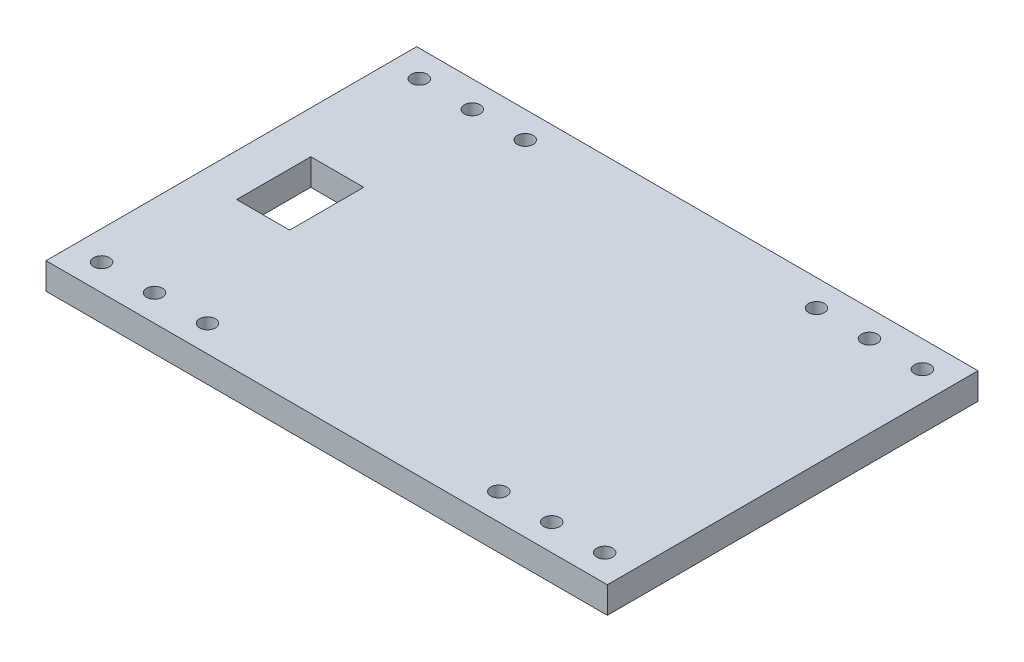
ISO-10303-21;
HEADER;
FILE_DESCRIPTION(('STEP AP214'),'2;1');
FILE_NAME('part.step','',(''),(''),'','','');
FILE_SCHEMA(('AUTOMOTIVE_DESIGN { 1 0 10303 214 1 1 1 1 }'));
ENDSEC;
DATA;
#1=APPLICATION_CONTEXT('core data for automotive mechanical design processes');
#2=APPLICATION_PROTOCOL_DEFINITION('international standard','automotive_design',2000,#1);
#3=PRODUCT_CONTEXT('',#1,'mechanical');
#4=PRODUCT('Part','Part','',(#3));
#5=PRODUCT_RELATED_PRODUCT_CATEGORY('part','',(#4));
#6=PRODUCT_DEFINITION_FORMATION('','',#4);
#7=PRODUCT_DEFINITION_CONTEXT('part definition',#1,'design');
#8=PRODUCT_DEFINITION('design','',#6,#7);
#9=PRODUCT_DEFINITION_SHAPE('','',#8);
#10=(LENGTH_UNIT() NAMED_UNIT(*) SI_UNIT(.MILLI.,.METRE.));
#11=(NAMED_UNIT(*) PLANE_ANGLE_UNIT() SI_UNIT($,.RADIAN.));
#12=(NAMED_UNIT(*) SI_UNIT($,.STERADIAN.) SOLID_ANGLE_UNIT());
#13=UNCERTAINTY_MEASURE_WITH_UNIT(LENGTH_MEASURE(1.E-05),#10,'distance_accuracy_value','');
#14=(GEOMETRIC_REPRESENTATION_CONTEXT(3) GLOBAL_UNCERTAINTY_ASSIGNED_CONTEXT((#13)) GLOBAL_UNIT_ASSIGNED_CONTEXT((#10,
#11,#12)) REPRESENTATION_CONTEXT('',''));
#15=CARTESIAN_POINT('',(0.,0.,0.));
#16=DIRECTION('',(0.,0.,1.));
#17=DIRECTION('',(1.,0.,0.));
#18=AXIS2_PLACEMENT_3D('',#15,#16,#17);
#19=CARTESIAN_POINT('',(-60.,5.,-35.));
#20=DIRECTION('',(0.,0.,1.));
#21=DIRECTION('',(1.,0.,0.));
#22=AXIS2_PLACEMENT_3D('',#19,#20,#21);
#23=PLANE('',#22);
#24=DIRECTION('',(-1.,0.,0.));
#25=VECTOR('',#24,1.);
#26=CARTESIAN_POINT('',(-60.,5.,-35.));
#27=LINE('',#26,#25);
#28=CARTESIAN_POINT('',(53.,5.,-35.));
#29=VERTEX_POINT('',#28);
#30=CARTESIAN_POINT('',(-53.,5.,-35.));
#31=VERTEX_POINT('',#30);
#32=EDGE_CURVE('E42',#29,#31,#27,.T.);
#33=ORIENTED_EDGE('',*,*,#32,.F.);
#34=DIRECTION('',(0.,1.,0.));
#35=VECTOR('',#34,1.);
#36=CARTESIAN_POINT('',(53.,0.,-35.));
#37=LINE('',#36,#35);
#38=CARTESIAN_POINT('',(53.,0.,-35.));
#39=VERTEX_POINT('',#38);
#40=EDGE_CURVE('E100',#39,#29,#37,.T.);
#41=ORIENTED_EDGE('',*,*,#40,.F.);
#42=DIRECTION('',(-1.,0.,0.));
#43=VECTOR('',#42,1.);
#44=CARTESIAN_POINT('',(-60.,0.,-35.));
#45=LINE('',#44,#43);
#46=CARTESIAN_POINT('',(-53.,0.,-35.));
#47=VERTEX_POINT('',#46);
#48=EDGE_CURVE('E111',#39,#47,#45,.T.);
#49=ORIENTED_EDGE('',*,*,#48,.T.);
#50=DIRECTION('',(0.,1.,0.));
#51=VECTOR('',#50,1.);
#52=CARTESIAN_POINT('',(-53.,0.,-35.));
#53=LINE('',#52,#51);
#54=EDGE_CURVE('E50',#47,#31,#53,.T.);
#55=ORIENTED_EDGE('',*,*,#54,.T.);
#56=EDGE_LOOP('',(#33,#41,#49,#55));
#57=FACE_BOUND('',#56,.T.);
#58=ADVANCED_FACE('F34',(#57),#23,.F.);
#59=CARTESIAN_POINT('',(-60.,5.,35.));
#60=DIRECTION('',(0.,0.,-1.));
#61=DIRECTION('',(-1.,0.,0.));
#62=AXIS2_PLACEMENT_3D('',#59,#60,#61);
#63=PLANE('',#62);
#64=DIRECTION('',(1.,0.,0.));
#65=VECTOR('',#64,1.);
#66=CARTESIAN_POINT('',(-60.,0.,35.));
#67=LINE('',#66,#65);
#68=CARTESIAN_POINT('',(-53.,0.,35.));
#69=VERTEX_POINT('',#68);
#70=CARTESIAN_POINT('',(53.,0.,35.));
#71=VERTEX_POINT('',#70);
#72=EDGE_CURVE('E37',#69,#71,#67,.T.);
#73=ORIENTED_EDGE('',*,*,#72,.T.);
#74=DIRECTION('',(0.,1.,0.));
#75=VECTOR('',#74,1.);
#76=CARTESIAN_POINT('',(53.,0.,35.));
#77=LINE('',#76,#75);
#78=CARTESIAN_POINT('',(53.,5.,35.));
#79=VERTEX_POINT('',#78);
#80=EDGE_CURVE('E58',#71,#79,#77,.T.);
#81=ORIENTED_EDGE('',*,*,#80,.T.);
#82=DIRECTION('',(1.,0.,0.));
#83=VECTOR('',#82,1.);
#84=CARTESIAN_POINT('',(-60.,5.,35.));
#85=LINE('',#84,#83);
#86=CARTESIAN_POINT('',(-53.,5.,35.));
#87=VERTEX_POINT('',#86);
#88=EDGE_CURVE('E11',#87,#79,#85,.T.);
#89=ORIENTED_EDGE('',*,*,#88,.F.);
#90=DIRECTION('',(0.,1.,0.));
#91=VECTOR('',#90,1.);
#92=CARTESIAN_POINT('',(-53.,0.,35.));
#93=LINE('',#92,#91);
#94=EDGE_CURVE('E151',#69,#87,#93,.T.);
#95=ORIENTED_EDGE('',*,*,#94,.F.);
#96=EDGE_LOOP('',(#73,#81,#89,#95));
#97=FACE_BOUND('',#96,.T.);
#98=ADVANCED_FACE('F245',(#97),#63,.F.);
#99=CARTESIAN_POINT('',(0.,5.,0.));
#100=DIRECTION('',(0.,-1.,0.));
#101=DIRECTION('',(0.,0.,-1.));
#102=AXIS2_PLACEMENT_3D('',#99,#100,#101);
#103=PLANE('',#102);
#104=CARTESIAN_POINT('',(37.5,5.,30.));
#105=DIRECTION('',(0.,1.,0.));
#106=DIRECTION('',(0.,0.,-1.));
#107=AXIS2_PLACEMENT_3D('',#104,#105,#106);
#108=CIRCLE('',#107,1.5);
#109=CARTESIAN_POINT('',(37.5,5.,28.5));
#110=VERTEX_POINT('',#109);
#111=EDGE_CURVE('E197',#110,#110,#108,.T.);
#112=ORIENTED_EDGE('',*,*,#111,.F.);
#113=EDGE_LOOP('',(#112));
#114=FACE_BOUND('',#113,.T.);
#115=CARTESIAN_POINT('',(47.5,5.,-30.0000000000001));
#116=DIRECTION('',(0.,1.,0.));
#117=DIRECTION('',(0.,0.,1.));
#118=AXIS2_PLACEMENT_3D('',#115,#116,#117);
#119=CIRCLE('',#118,1.5);
#120=CARTESIAN_POINT('',(47.5,5.,-28.5000000000001));
#121=VERTEX_POINT('',#120);
#122=EDGE_CURVE('E190',#121,#121,#119,.T.);
#123=ORIENTED_EDGE('',*,*,#122,.F.);
#124=EDGE_LOOP('',(#123));
#125=FACE_BOUND('',#124,.T.);
#126=CARTESIAN_POINT('',(37.5,5.,-30.));
#127=DIRECTION('',(0.,1.,0.));
#128=DIRECTION('',(0.,0.,1.));
#129=AXIS2_PLACEMENT_3D('',#126,#127,#128);
#130=CIRCLE('',#129,1.5);
#131=CARTESIAN_POINT('',(37.5,5.,-28.5));
#132=VERTEX_POINT('',#131);
#133=EDGE_CURVE('E209',#132,#132,#130,.T.);
#134=ORIENTED_EDGE('',*,*,#133,.F.);
#135=EDGE_LOOP('',(#134));
#136=FACE_BOUND('',#135,.T.);
#137=CARTESIAN_POINT('',(27.5,5.,-29.9999999999999));
#138=DIRECTION('',(0.,1.,0.));
#139=DIRECTION('',(0.,0.,1.));
#140=AXIS2_PLACEMENT_3D('',#137,#138,#139);
#141=CIRCLE('',#140,1.50000000000001);
#142=CARTESIAN_POINT('',(27.5,5.,-28.4999999999999));
#143=VERTEX_POINT('',#142);
#144=EDGE_CURVE('E202',#143,#143,#141,.T.);
#145=ORIENTED_EDGE('',*,*,#144,.F.);
#146=EDGE_LOOP('',(#145));
#147=FACE_BOUND('',#146,.T.);
#148=CARTESIAN_POINT('',(47.5,5.,30.0000000000001));
#149=DIRECTION('',(0.,1.,0.));
#150=DIRECTION('',(0.,0.,-1.));
#151=AXIS2_PLACEMENT_3D('',#148,#149,#150);
#152=CIRCLE('',#151,1.5);
#153=CARTESIAN_POINT('',(47.5,5.,28.5000000000001));
#154=VERTEX_POINT('',#153);
#155=EDGE_CURVE('E166',#154,#154,#152,.T.);
#156=ORIENTED_EDGE('',*,*,#155,.F.);
#157=EDGE_LOOP('',(#156));
#158=FACE_BOUND('',#157,.T.);
#159=CARTESIAN_POINT('',(27.5,5.,29.9999999999999));
#160=DIRECTION('',(0.,1.,0.));
#161=DIRECTION('',(0.,0.,-1.));
#162=AXIS2_PLACEMENT_3D('',#159,#160,#161);
#163=CIRCLE('',#162,1.50000000000001);
#164=CARTESIAN_POINT('',(27.5,5.,28.4999999999999));
#165=VERTEX_POINT('',#164);
#166=EDGE_CURVE('E173',#165,#165,#163,.T.);
#167=ORIENTED_EDGE('',*,*,#166,.F.);
#168=EDGE_LOOP('',(#167));
#169=FACE_BOUND('',#168,.T.);
#170=CARTESIAN_POINT('',(-47.5,5.,30.0000000000001));
#171=DIRECTION('',(0.,1.,0.));
#172=DIRECTION('',(0.,0.,1.));
#173=AXIS2_PLACEMENT_3D('',#170,#171,#172);
#174=CIRCLE('',#173,1.5);
#175=CARTESIAN_POINT('',(-47.5,5.,31.5000000000001));
#176=VERTEX_POINT('',#175);
#177=EDGE_CURVE('E179',#176,#176,#174,.T.);
#178=ORIENTED_EDGE('',*,*,#177,.F.);
#179=EDGE_LOOP('',(#178));
#180=FACE_BOUND('',#179,.T.);
#181=CARTESIAN_POINT('',(-27.5,5.,29.9999999999999));
#182=DIRECTION('',(0.,1.,0.));
#183=DIRECTION('',(0.,0.,1.));
#184=AXIS2_PLACEMENT_3D('',#181,#182,#183);
#185=CIRCLE('',#184,1.5);
#186=CARTESIAN_POINT('',(-27.5,5.,31.4999999999999));
#187=VERTEX_POINT('',#186);
#188=EDGE_CURVE('E185',#187,#187,#185,.T.);
#189=ORIENTED_EDGE('',*,*,#188,.F.);
#190=EDGE_LOOP('',(#189));
#191=FACE_BOUND('',#190,.T.);
#192=CARTESIAN_POINT('',(-27.5,5.,-29.9999999999999));
#193=DIRECTION('',(0.,1.,0.));
#194=DIRECTION('',(0.,0.,-1.));
#195=AXIS2_PLACEMENT_3D('',#192,#193,#194);
#196=CIRCLE('',#195,1.5);
#197=CARTESIAN_POINT('',(-27.5,5.,-31.4999999999999));
#198=VERTEX_POINT('',#197);
#199=EDGE_CURVE('E226',#198,#198,#196,.T.);
#200=ORIENTED_EDGE('',*,*,#199,.F.);
#201=EDGE_LOOP('',(#200));
#202=FACE_BOUND('',#201,.T.);
#203=CARTESIAN_POINT('',(-37.5,5.,-30.));
#204=DIRECTION('',(0.,1.,0.));
#205=DIRECTION('',(0.,0.,-1.));
#206=AXIS2_PLACEMENT_3D('',#203,#204,#205);
#207=CIRCLE('',#206,1.5);
#208=CARTESIAN_POINT('',(-37.5,5.,-31.5));
#209=VERTEX_POINT('',#208);
#210=EDGE_CURVE('E220',#209,#209,#207,.T.);
#211=ORIENTED_EDGE('',*,*,#210,.F.);
#212=EDGE_LOOP('',(#211));
#213=FACE_BOUND('',#212,.T.);
#214=CARTESIAN_POINT('',(-47.5,5.,-30.0000000000001));
#215=DIRECTION('',(0.,1.,0.));
#216=DIRECTION('',(0.,0.,-1.));
#217=AXIS2_PLACEMENT_3D('',#214,#215,#216);
#218=CIRCLE('',#217,1.5);
#219=CARTESIAN_POINT('',(-47.5,5.,-31.5000000000001));
#220=VERTEX_POINT('',#219);
#221=EDGE_CURVE('E214',#220,#220,#218,.T.);
#222=ORIENTED_EDGE('',*,*,#221,.F.);
#223=EDGE_LOOP('',(#222));
#224=FACE_BOUND('',#223,.T.);
#225=CARTESIAN_POINT('',(-37.5,5.,30.));
#226=DIRECTION('',(0.,1.,0.));
#227=DIRECTION('',(0.,0.,1.));
#228=AXIS2_PLACEMENT_3D('',#225,#226,#227);
#229=CIRCLE('',#228,1.5);
#230=CARTESIAN_POINT('',(-37.5,5.,31.5));
#231=VERTEX_POINT('',#230);
#232=EDGE_CURVE('E160',#231,#231,#229,.T.);
#233=ORIENTED_EDGE('',*,*,#232,.F.);
#234=EDGE_LOOP('',(#233));
#235=FACE_BOUND('',#234,.T.);
#236=DIRECTION('',(1.,0.,0.));
#237=VECTOR('',#236,1.);
#238=CARTESIAN_POINT('',(-45.,5.,7.));
#239=LINE('',#238,#237);
#240=CARTESIAN_POINT('',(-45.,5.,7.));
#241=VERTEX_POINT('',#240);
#242=CARTESIAN_POINT('',(-35.,5.,7.));
#243=VERTEX_POINT('',#242);
#244=EDGE_CURVE('E136',#241,#243,#239,.T.);
#245=ORIENTED_EDGE('',*,*,#244,.F.);
#246=DIRECTION('',(0.,0.,1.));
#247=VECTOR('',#246,1.);
#248=CARTESIAN_POINT('',(-45.,5.,-7.));
#249=LINE('',#248,#247);
#250=CARTESIAN_POINT('',(-45.,5.,-7.));
#251=VERTEX_POINT('',#250);
#252=EDGE_CURVE('E139',#251,#241,#249,.T.);
#253=ORIENTED_EDGE('',*,*,#252,.F.);
#254=DIRECTION('',(-1.,0.,0.));
#255=VECTOR('',#254,1.);
#256=CARTESIAN_POINT('',(-45.,5.,-7.));
#257=LINE('',#256,#255);
#258=CARTESIAN_POINT('',(-35.,5.,-7.));
#259=VERTEX_POINT('',#258);
#260=EDGE_CURVE('E129',#259,#251,#257,.T.);
#261=ORIENTED_EDGE('',*,*,#260,.F.);
#262=DIRECTION('',(0.,0.,-1.));
#263=VECTOR('',#262,1.);
#264=CARTESIAN_POINT('',(-35.,5.,-7.));
#265=LINE('',#264,#263);
#266=EDGE_CURVE('E133',#243,#259,#265,.T.);
#267=ORIENTED_EDGE('',*,*,#266,.F.);
#268=EDGE_LOOP('',(#245,#253,#261,#267));
#269=FACE_BOUND('',#268,.T.);
#270=ORIENTED_EDGE('',*,*,#88,.T.);
#271=DIRECTION('',(0.,0.,1.));
#272=VECTOR('',#271,1.);
#273=CARTESIAN_POINT('',(53.,5.,-35.));
#274=LINE('',#273,#272);
#275=EDGE_CURVE('E106',#29,#79,#274,.T.);
#276=ORIENTED_EDGE('',*,*,#275,.F.);
#277=ORIENTED_EDGE('',*,*,#32,.T.);
#278=DIRECTION('',(0.,0.,-1.));
#279=VECTOR('',#278,1.);
#280=CARTESIAN_POINT('',(-53.,5.,-35.));
#281=LINE('',#280,#279);
#282=EDGE_CURVE('E154',#87,#31,#281,.T.);
#283=ORIENTED_EDGE('',*,*,#282,.F.);
#284=EDGE_LOOP('',(#270,#276,#277,#283));
#285=FACE_BOUND('',#284,.T.);
#286=ADVANCED_FACE('F242',(#114,#125,#136,#147,#158,#169,#180,#191,#202,#213,#224,#235,#269,
#285),#103,.F.);
#287=CARTESIAN_POINT('',(0.,0.,0.));
#288=DIRECTION('',(0.,-1.,0.));
#289=DIRECTION('',(0.,0.,-1.));
#290=AXIS2_PLACEMENT_3D('',#287,#288,#289);
#291=PLANE('',#290);
#292=CARTESIAN_POINT('',(37.5,0.,30.));
#293=DIRECTION('',(0.,1.,0.));
#294=DIRECTION('',(0.,0.,-1.));
#295=AXIS2_PLACEMENT_3D('',#292,#293,#294);
#296=CIRCLE('',#295,1.5);
#297=CARTESIAN_POINT('',(37.5,0.,28.5));
#298=VERTEX_POINT('',#297);
#299=EDGE_CURVE('E170',#298,#298,#296,.T.);
#300=ORIENTED_EDGE('',*,*,#299,.T.);
#301=EDGE_LOOP('',(#300));
#302=FACE_BOUND('',#301,.T.);
#303=CARTESIAN_POINT('',(47.5,0.,-30.0000000000001));
#304=DIRECTION('',(0.,1.,0.));
#305=DIRECTION('',(0.,0.,1.));
#306=AXIS2_PLACEMENT_3D('',#303,#304,#305);
#307=CIRCLE('',#306,1.5);
#308=CARTESIAN_POINT('',(47.5,0.,-28.5000000000001));
#309=VERTEX_POINT('',#308);
#310=EDGE_CURVE('E193',#309,#309,#307,.T.);
#311=ORIENTED_EDGE('',*,*,#310,.T.);
#312=EDGE_LOOP('',(#311));
#313=FACE_BOUND('',#312,.T.);
#314=CARTESIAN_POINT('',(37.5,0.,-30.));
#315=DIRECTION('',(0.,1.,0.));
#316=DIRECTION('',(0.,0.,1.));
#317=AXIS2_PLACEMENT_3D('',#314,#315,#316);
#318=CIRCLE('',#317,1.5);
#319=CARTESIAN_POINT('',(37.5,0.,-28.5));
#320=VERTEX_POINT('',#319);
#321=EDGE_CURVE('E194',#320,#320,#318,.T.);
#322=ORIENTED_EDGE('',*,*,#321,.T.);
#323=EDGE_LOOP('',(#322));
#324=FACE_BOUND('',#323,.T.);
#325=CARTESIAN_POINT('',(27.5,0.,-29.9999999999999));
#326=DIRECTION('',(0.,1.,0.));
#327=DIRECTION('',(0.,0.,1.));
#328=AXIS2_PLACEMENT_3D('',#325,#326,#327);
#329=CIRCLE('',#328,1.50000000000001);
#330=CARTESIAN_POINT('',(27.5,0.,-28.4999999999999));
#331=VERTEX_POINT('',#330);
#332=EDGE_CURVE('E205',#331,#331,#329,.T.);
#333=ORIENTED_EDGE('',*,*,#332,.T.);
#334=EDGE_LOOP('',(#333));
#335=FACE_BOUND('',#334,.T.);
#336=CARTESIAN_POINT('',(47.5,0.,30.0000000000001));
#337=DIRECTION('',(0.,1.,0.));
#338=DIRECTION('',(0.,0.,-1.));
#339=AXIS2_PLACEMENT_3D('',#336,#337,#338);
#340=CIRCLE('',#339,1.5);
#341=CARTESIAN_POINT('',(47.5,0.,28.5000000000001));
#342=VERTEX_POINT('',#341);
#343=EDGE_CURVE('E169',#342,#342,#340,.T.);
#344=ORIENTED_EDGE('',*,*,#343,.T.);
#345=EDGE_LOOP('',(#344));
#346=FACE_BOUND('',#345,.T.);
#347=CARTESIAN_POINT('',(27.5,0.,29.9999999999999));
#348=DIRECTION('',(0.,1.,0.));
#349=DIRECTION('',(0.,0.,-1.));
#350=AXIS2_PLACEMENT_3D('',#347,#348,#349);
#351=CIRCLE('',#350,1.50000000000001);
#352=CARTESIAN_POINT('',(27.5,0.,28.4999999999999));
#353=VERTEX_POINT('',#352);
#354=EDGE_CURVE('E176',#353,#353,#351,.T.);
#355=ORIENTED_EDGE('',*,*,#354,.T.);
#356=EDGE_LOOP('',(#355));
#357=FACE_BOUND('',#356,.T.);
#358=CARTESIAN_POINT('',(-47.5,0.,30.0000000000001));
#359=DIRECTION('',(0.,1.,0.));
#360=DIRECTION('',(0.,0.,1.));
#361=AXIS2_PLACEMENT_3D('',#358,#359,#360);
#362=CIRCLE('',#361,1.5);
#363=CARTESIAN_POINT('',(-47.5,0.,31.5000000000001));
#364=VERTEX_POINT('',#363);
#365=EDGE_CURVE('E182',#364,#364,#362,.T.);
#366=ORIENTED_EDGE('',*,*,#365,.T.);
#367=EDGE_LOOP('',(#366));
#368=FACE_BOUND('',#367,.T.);
#369=CARTESIAN_POINT('',(-27.5,0.,29.9999999999999));
#370=DIRECTION('',(0.,1.,0.));
#371=DIRECTION('',(0.,0.,1.));
#372=AXIS2_PLACEMENT_3D('',#369,#370,#371);
#373=CIRCLE('',#372,1.5);
#374=CARTESIAN_POINT('',(-27.5,0.,31.4999999999999));
#375=VERTEX_POINT('',#374);
#376=EDGE_CURVE('E163',#375,#375,#373,.T.);
#377=ORIENTED_EDGE('',*,*,#376,.T.);
#378=EDGE_LOOP('',(#377));
#379=FACE_BOUND('',#378,.T.);
#380=CARTESIAN_POINT('',(-27.5,0.,-29.9999999999999));
#381=DIRECTION('',(0.,1.,0.));
#382=DIRECTION('',(0.,0.,-1.));
#383=AXIS2_PLACEMENT_3D('',#380,#381,#382);
#384=CIRCLE('',#383,1.5);
#385=CARTESIAN_POINT('',(-27.5,0.,-31.4999999999999));
#386=VERTEX_POINT('',#385);
#387=EDGE_CURVE('E206',#386,#386,#384,.T.);
#388=ORIENTED_EDGE('',*,*,#387,.T.);
#389=EDGE_LOOP('',(#388));
#390=FACE_BOUND('',#389,.T.);
#391=CARTESIAN_POINT('',(-37.5,0.,-30.));
#392=DIRECTION('',(0.,1.,0.));
#393=DIRECTION('',(0.,0.,-1.));
#394=AXIS2_PLACEMENT_3D('',#391,#392,#393);
#395=CIRCLE('',#394,1.5);
#396=CARTESIAN_POINT('',(-37.5,0.,-31.5));
#397=VERTEX_POINT('',#396);
#398=EDGE_CURVE('E223',#397,#397,#395,.T.);
#399=ORIENTED_EDGE('',*,*,#398,.T.);
#400=EDGE_LOOP('',(#399));
#401=FACE_BOUND('',#400,.T.);
#402=CARTESIAN_POINT('',(-47.5,0.,-30.0000000000001));
#403=DIRECTION('',(0.,1.,0.));
#404=DIRECTION('',(0.,0.,-1.));
#405=AXIS2_PLACEMENT_3D('',#402,#403,#404);
#406=CIRCLE('',#405,1.5);
#407=CARTESIAN_POINT('',(-47.5,0.,-31.5000000000001));
#408=VERTEX_POINT('',#407);
#409=EDGE_CURVE('E217',#408,#408,#406,.T.);
#410=ORIENTED_EDGE('',*,*,#409,.T.);
#411=EDGE_LOOP('',(#410));
#412=FACE_BOUND('',#411,.T.);
#413=CARTESIAN_POINT('',(-37.5,0.,30.));
#414=DIRECTION('',(0.,1.,0.));
#415=DIRECTION('',(0.,0.,1.));
#416=AXIS2_PLACEMENT_3D('',#413,#414,#415);
#417=CIRCLE('',#416,1.5);
#418=CARTESIAN_POINT('',(-37.5,0.,31.5));
#419=VERTEX_POINT('',#418);
#420=EDGE_CURVE('E156',#419,#419,#417,.T.);
#421=ORIENTED_EDGE('',*,*,#420,.T.);
#422=EDGE_LOOP('',(#421));
#423=FACE_BOUND('',#422,.T.);
#424=DIRECTION('',(0.,0.,1.));
#425=VECTOR('',#424,1.);
#426=CARTESIAN_POINT('',(53.,0.,-35.));
#427=LINE('',#426,#425);
#428=EDGE_CURVE('E97',#39,#71,#427,.T.);
#429=ORIENTED_EDGE('',*,*,#428,.T.);
#430=ORIENTED_EDGE('',*,*,#72,.F.);
#431=DIRECTION('',(0.,0.,-1.));
#432=VECTOR('',#431,1.);
#433=CARTESIAN_POINT('',(-53.,0.,-35.));
#434=LINE('',#433,#432);
#435=EDGE_CURVE('E116',#69,#47,#434,.T.);
#436=ORIENTED_EDGE('',*,*,#435,.T.);
#437=ORIENTED_EDGE('',*,*,#48,.F.);
#438=EDGE_LOOP('',(#429,#430,#436,#437));
#439=FACE_BOUND('',#438,.T.);
#440=DIRECTION('',(0.,0.,1.));
#441=VECTOR('',#440,1.);
#442=CARTESIAN_POINT('',(-45.,0.,-7.));
#443=LINE('',#442,#441);
#444=CARTESIAN_POINT('',(-45.,0.,-7.));
#445=VERTEX_POINT('',#444);
#446=CARTESIAN_POINT('',(-45.,0.,7.));
#447=VERTEX_POINT('',#446);
#448=EDGE_CURVE('E132',#445,#447,#443,.T.);
#449=ORIENTED_EDGE('',*,*,#448,.T.);
#450=DIRECTION('',(1.,0.,0.));
#451=VECTOR('',#450,1.);
#452=CARTESIAN_POINT('',(-45.,0.,7.));
#453=LINE('',#452,#451);
#454=CARTESIAN_POINT('',(-35.,0.,7.));
#455=VERTEX_POINT('',#454);
#456=EDGE_CURVE('E146',#447,#455,#453,.T.);
#457=ORIENTED_EDGE('',*,*,#456,.T.);
#458=DIRECTION('',(0.,0.,-1.));
#459=VECTOR('',#458,1.);
#460=CARTESIAN_POINT('',(-35.,0.,-7.));
#461=LINE('',#460,#459);
#462=CARTESIAN_POINT('',(-35.,0.,-7.));
#463=VERTEX_POINT('',#462);
#464=EDGE_CURVE('E143',#455,#463,#461,.T.);
#465=ORIENTED_EDGE('',*,*,#464,.T.);
#466=DIRECTION('',(-1.,0.,0.));
#467=VECTOR('',#466,1.);
#468=CARTESIAN_POINT('',(-45.,0.,-7.));
#469=LINE('',#468,#467);
#470=EDGE_CURVE('E126',#463,#445,#469,.T.);
#471=ORIENTED_EDGE('',*,*,#470,.T.);
#472=EDGE_LOOP('',(#449,#457,#465,#471));
#473=FACE_BOUND('',#472,.T.);
#474=ADVANCED_FACE('F114',(#302,#313,#324,#335,#346,#357,#368,#379,#390,#401,#412,#423,#439,
#473),#291,.T.);
#475=CARTESIAN_POINT('',(-45.,0.,-7.));
#476=DIRECTION('',(-1.,0.,0.));
#477=DIRECTION('',(0.,0.,1.));
#478=AXIS2_PLACEMENT_3D('',#475,#476,#477);
#479=PLANE('',#478);
#480=ORIENTED_EDGE('',*,*,#252,.T.);
#481=DIRECTION('',(0.,1.,0.));
#482=VECTOR('',#481,1.);
#483=CARTESIAN_POINT('',(-45.,0.,7.));
#484=LINE('',#483,#482);
#485=EDGE_CURVE('E122',#447,#241,#484,.T.);
#486=ORIENTED_EDGE('',*,*,#485,.F.);
#487=ORIENTED_EDGE('',*,*,#448,.F.);
#488=DIRECTION('',(0.,1.,0.));
#489=VECTOR('',#488,1.);
#490=CARTESIAN_POINT('',(-45.,0.,-7.));
#491=LINE('',#490,#489);
#492=EDGE_CURVE('E117',#445,#251,#491,.T.);
#493=ORIENTED_EDGE('',*,*,#492,.T.);
#494=EDGE_LOOP('',(#480,#486,#487,#493));
#495=FACE_BOUND('',#494,.T.);
#496=ADVANCED_FACE('F284',(#495),#479,.F.);
#497=CARTESIAN_POINT('',(-45.,0.,-7.));
#498=DIRECTION('',(0.,0.,-1.));
#499=DIRECTION('',(-1.,0.,0.));
#500=AXIS2_PLACEMENT_3D('',#497,#498,#499);
#501=PLANE('',#500);
#502=ORIENTED_EDGE('',*,*,#260,.T.);
#503=ORIENTED_EDGE('',*,*,#492,.F.);
#504=ORIENTED_EDGE('',*,*,#470,.F.);
#505=DIRECTION('',(0.,1.,0.));
#506=VECTOR('',#505,1.);
#507=CARTESIAN_POINT('',(-35.,0.,-7.));
#508=LINE('',#507,#506);
#509=EDGE_CURVE('E118',#463,#259,#508,.T.);
#510=ORIENTED_EDGE('',*,*,#509,.T.);
#511=EDGE_LOOP('',(#502,#503,#504,#510));
#512=FACE_BOUND('',#511,.T.);
#513=ADVANCED_FACE('F288',(#512),#501,.F.);
#514=CARTESIAN_POINT('',(-35.,0.,-7.));
#515=DIRECTION('',(1.,0.,0.));
#516=DIRECTION('',(0.,0.,-1.));
#517=AXIS2_PLACEMENT_3D('',#514,#515,#516);
#518=PLANE('',#517);
#519=ORIENTED_EDGE('',*,*,#266,.T.);
#520=ORIENTED_EDGE('',*,*,#509,.F.);
#521=ORIENTED_EDGE('',*,*,#464,.F.);
#522=DIRECTION('',(0.,1.,0.));
#523=VECTOR('',#522,1.);
#524=CARTESIAN_POINT('',(-35.,0.,7.));
#525=LINE('',#524,#523);
#526=EDGE_CURVE('E125',#455,#243,#525,.T.);
#527=ORIENTED_EDGE('',*,*,#526,.T.);
#528=EDGE_LOOP('',(#519,#520,#521,#527));
#529=FACE_BOUND('',#528,.T.);
#530=ADVANCED_FACE('F272',(#529),#518,.F.);
#531=CARTESIAN_POINT('',(-45.,0.,7.));
#532=DIRECTION('',(0.,0.,1.));
#533=DIRECTION('',(1.,0.,0.));
#534=AXIS2_PLACEMENT_3D('',#531,#532,#533);
#535=PLANE('',#534);
#536=ORIENTED_EDGE('',*,*,#244,.T.);
#537=ORIENTED_EDGE('',*,*,#526,.F.);
#538=ORIENTED_EDGE('',*,*,#456,.F.);
#539=ORIENTED_EDGE('',*,*,#485,.T.);
#540=EDGE_LOOP('',(#536,#537,#538,#539));
#541=FACE_BOUND('',#540,.T.);
#542=ADVANCED_FACE('F264',(#541),#535,.F.);
#543=CARTESIAN_POINT('',(-53.,0.,-35.));
#544=DIRECTION('',(1.,0.,0.));
#545=DIRECTION('',(0.,0.,-1.));
#546=AXIS2_PLACEMENT_3D('',#543,#544,#545);
#547=PLANE('',#546);
#548=ORIENTED_EDGE('',*,*,#282,.T.);
#549=ORIENTED_EDGE('',*,*,#54,.F.);
#550=ORIENTED_EDGE('',*,*,#435,.F.);
#551=ORIENTED_EDGE('',*,*,#94,.T.);
#552=EDGE_LOOP('',(#548,#549,#550,#551));
#553=FACE_BOUND('',#552,.T.);
#554=ADVANCED_FACE('F262',(#553),#547,.F.);
#555=CARTESIAN_POINT('',(53.,0.,-35.));
#556=DIRECTION('',(-1.,0.,0.));
#557=DIRECTION('',(0.,0.,1.));
#558=AXIS2_PLACEMENT_3D('',#555,#556,#557);
#559=PLANE('',#558);
#560=ORIENTED_EDGE('',*,*,#275,.T.);
#561=ORIENTED_EDGE('',*,*,#80,.F.);
#562=ORIENTED_EDGE('',*,*,#428,.F.);
#563=ORIENTED_EDGE('',*,*,#40,.T.);
#564=EDGE_LOOP('',(#560,#561,#562,#563));
#565=FACE_BOUND('',#564,.T.);
#566=ADVANCED_FACE('F99',(#565),#559,.F.);
#567=CARTESIAN_POINT('',(-37.5,0.,30.));
#568=DIRECTION('',(0.,1.,0.));
#569=DIRECTION('',(0.,0.,1.));
#570=AXIS2_PLACEMENT_3D('',#567,#568,#569);
#571=CYLINDRICAL_SURFACE('',#570,1.5);
#572=ORIENTED_EDGE('',*,*,#420,.F.);
#573=EDGE_LOOP('',(#572));
#574=FACE_BOUND('',#573,.T.);
#575=ORIENTED_EDGE('',*,*,#232,.T.);
#576=EDGE_LOOP('',(#575));
#577=FACE_BOUND('',#576,.T.);
#578=ADVANCED_FACE('F270',(#574,#577),#571,.F.);
#579=CARTESIAN_POINT('',(-47.5,0.,-30.0000000000001));
#580=DIRECTION('',(0.,1.,0.));
#581=DIRECTION('',(0.,0.,1.));
#582=AXIS2_PLACEMENT_3D('',#579,#580,#581);
#583=CYLINDRICAL_SURFACE('',#582,1.5);
#584=ORIENTED_EDGE('',*,*,#409,.F.);
#585=EDGE_LOOP('',(#584));
#586=FACE_BOUND('',#585,.T.);
#587=ORIENTED_EDGE('',*,*,#221,.T.);
#588=EDGE_LOOP('',(#587));
#589=FACE_BOUND('',#588,.T.);
#590=ADVANCED_FACE('F352',(#586,#589),#583,.F.);
#591=CARTESIAN_POINT('',(-37.5,0.,-30.));
#592=DIRECTION('',(0.,1.,0.));
#593=DIRECTION('',(0.,0.,1.));
#594=AXIS2_PLACEMENT_3D('',#591,#592,#593);
#595=CYLINDRICAL_SURFACE('',#594,1.5);
#596=ORIENTED_EDGE('',*,*,#398,.F.);
#597=EDGE_LOOP('',(#596));
#598=FACE_BOUND('',#597,.T.);
#599=ORIENTED_EDGE('',*,*,#210,.T.);
#600=EDGE_LOOP('',(#599));
#601=FACE_BOUND('',#600,.T.);
#602=ADVANCED_FACE('F238',(#598,#601),#595,.F.);
#603=CARTESIAN_POINT('',(-27.5,0.,-29.9999999999999));
#604=DIRECTION('',(0.,1.,0.));
#605=DIRECTION('',(0.,0.,1.));
#606=AXIS2_PLACEMENT_3D('',#603,#604,#605);
#607=CYLINDRICAL_SURFACE('',#606,1.5);
#608=ORIENTED_EDGE('',*,*,#387,.F.);
#609=EDGE_LOOP('',(#608));
#610=FACE_BOUND('',#609,.T.);
#611=ORIENTED_EDGE('',*,*,#199,.T.);
#612=EDGE_LOOP('',(#611));
#613=FACE_BOUND('',#612,.T.);
#614=ADVANCED_FACE('F234',(#610,#613),#607,.F.);
#615=CARTESIAN_POINT('',(-27.5,0.,29.9999999999999));
#616=DIRECTION('',(0.,1.,0.));
#617=DIRECTION('',(0.,0.,1.));
#618=AXIS2_PLACEMENT_3D('',#615,#616,#617);
#619=CYLINDRICAL_SURFACE('',#618,1.5);
#620=ORIENTED_EDGE('',*,*,#376,.F.);
#621=EDGE_LOOP('',(#620));
#622=FACE_BOUND('',#621,.T.);
#623=ORIENTED_EDGE('',*,*,#188,.T.);
#624=EDGE_LOOP('',(#623));
#625=FACE_BOUND('',#624,.T.);
#626=ADVANCED_FACE('F237',(#622,#625),#619,.F.);
#627=CARTESIAN_POINT('',(-47.5,0.,30.0000000000001));
#628=DIRECTION('',(0.,1.,0.));
#629=DIRECTION('',(0.,0.,1.));
#630=AXIS2_PLACEMENT_3D('',#627,#628,#629);
#631=CYLINDRICAL_SURFACE('',#630,1.5);
#632=ORIENTED_EDGE('',*,*,#365,.F.);
#633=EDGE_LOOP('',(#632));
#634=FACE_BOUND('',#633,.T.);
#635=ORIENTED_EDGE('',*,*,#177,.T.);
#636=EDGE_LOOP('',(#635));
#637=FACE_BOUND('',#636,.T.);
#638=ADVANCED_FACE('F386',(#634,#637),#631,.F.);
#639=CARTESIAN_POINT('',(27.5,0.,29.9999999999999));
#640=DIRECTION('',(0.,1.,0.));
#641=DIRECTION('',(0.,0.,1.));
#642=AXIS2_PLACEMENT_3D('',#639,#640,#641);
#643=CYLINDRICAL_SURFACE('',#642,1.50000000000001);
#644=ORIENTED_EDGE('',*,*,#354,.F.);
#645=EDGE_LOOP('',(#644));
#646=FACE_BOUND('',#645,.T.);
#647=ORIENTED_EDGE('',*,*,#166,.T.);
#648=EDGE_LOOP('',(#647));
#649=FACE_BOUND('',#648,.T.);
#650=ADVANCED_FACE('F396',(#646,#649),#643,.F.);
#651=CARTESIAN_POINT('',(47.5,0.,30.0000000000001));
#652=DIRECTION('',(0.,1.,0.));
#653=DIRECTION('',(0.,0.,1.));
#654=AXIS2_PLACEMENT_3D('',#651,#652,#653);
#655=CYLINDRICAL_SURFACE('',#654,1.5);
#656=ORIENTED_EDGE('',*,*,#343,.F.);
#657=EDGE_LOOP('',(#656));
#658=FACE_BOUND('',#657,.T.);
#659=ORIENTED_EDGE('',*,*,#155,.T.);
#660=EDGE_LOOP('',(#659));
#661=FACE_BOUND('',#660,.T.);
#662=ADVANCED_FACE('F406',(#658,#661),#655,.F.);
#663=CARTESIAN_POINT('',(27.5,0.,-29.9999999999999));
#664=DIRECTION('',(0.,1.,0.));
#665=DIRECTION('',(0.,0.,1.));
#666=AXIS2_PLACEMENT_3D('',#663,#664,#665);
#667=CYLINDRICAL_SURFACE('',#666,1.50000000000001);
#668=ORIENTED_EDGE('',*,*,#332,.F.);
#669=EDGE_LOOP('',(#668));
#670=FACE_BOUND('',#669,.T.);
#671=ORIENTED_EDGE('',*,*,#144,.T.);
#672=EDGE_LOOP('',(#671));
#673=FACE_BOUND('',#672,.T.);
#674=ADVANCED_FACE('F416',(#670,#673),#667,.F.);
#675=CARTESIAN_POINT('',(37.5,0.,-30.));
#676=DIRECTION('',(0.,1.,0.));
#677=DIRECTION('',(0.,0.,1.));
#678=AXIS2_PLACEMENT_3D('',#675,#676,#677);
#679=CYLINDRICAL_SURFACE('',#678,1.5);
#680=ORIENTED_EDGE('',*,*,#321,.F.);
#681=EDGE_LOOP('',(#680));
#682=FACE_BOUND('',#681,.T.);
#683=ORIENTED_EDGE('',*,*,#133,.T.);
#684=EDGE_LOOP('',(#683));
#685=FACE_BOUND('',#684,.T.);
#686=ADVANCED_FACE('F426',(#682,#685),#679,.F.);
#687=CARTESIAN_POINT('',(47.5,0.,-30.0000000000001));
#688=DIRECTION('',(0.,1.,0.));
#689=DIRECTION('',(0.,0.,1.));
#690=AXIS2_PLACEMENT_3D('',#687,#688,#689);
#691=CYLINDRICAL_SURFACE('',#690,1.5);
#692=ORIENTED_EDGE('',*,*,#310,.F.);
#693=EDGE_LOOP('',(#692));
#694=FACE_BOUND('',#693,.T.);
#695=ORIENTED_EDGE('',*,*,#122,.T.);
#696=EDGE_LOOP('',(#695));
#697=FACE_BOUND('',#696,.T.);
#698=ADVANCED_FACE('F436',(#694,#697),#691,.F.);
#699=CARTESIAN_POINT('',(37.5,0.,30.));
#700=DIRECTION('',(0.,1.,0.));
#701=DIRECTION('',(0.,0.,1.));
#702=AXIS2_PLACEMENT_3D('',#699,#700,#701);
#703=CYLINDRICAL_SURFACE('',#702,1.5);
#704=ORIENTED_EDGE('',*,*,#299,.F.);
#705=EDGE_LOOP('',(#704));
#706=FACE_BOUND('',#705,.T.);
#707=ORIENTED_EDGE('',*,*,#111,.T.);
#708=EDGE_LOOP('',(#707));
#709=FACE_BOUND('',#708,.T.);
#710=ADVANCED_FACE('F446',(#706,#709),#703,.F.);
#711=CLOSED_SHELL('',(#58,#98,#286,#474,#496,#513,#530,#542,#554,#566,#578,#590,#602,#614,#626,
#638,#650,#662,#674,#686,#698,#710));
#712=MANIFOLD_SOLID_BREP('B2',#711);
#713=ADVANCED_BREP_SHAPE_REPRESENTATION('',(#18,#712),#14);
#714=SHAPE_DEFINITION_REPRESENTATION(#9,#713);
ENDSEC;
END-ISO-10303-21;
